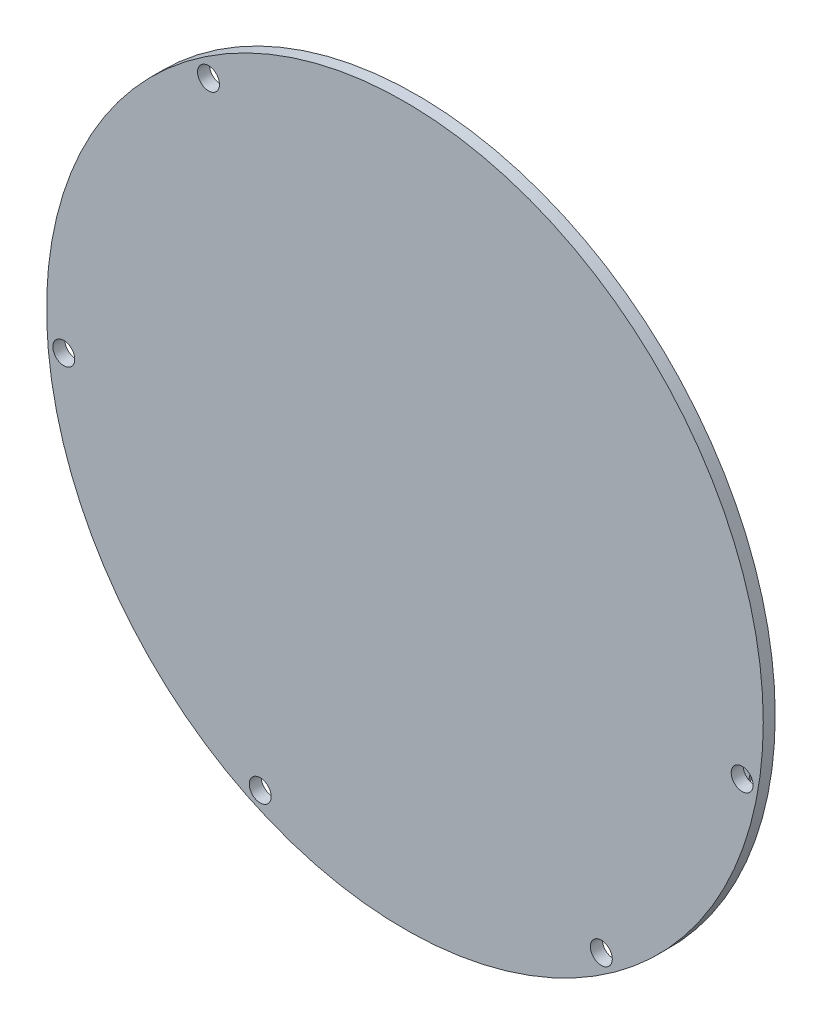
ISO-10303-21;
HEADER;
FILE_DESCRIPTION(('STEP AP214'),'2;1');
FILE_NAME('part.step','',(''),(''),'','','');
FILE_SCHEMA(('AUTOMOTIVE_DESIGN { 1 0 10303 214 1 1 1 1 }'));
ENDSEC;
DATA;
#1=APPLICATION_CONTEXT('core data for automotive mechanical design processes');
#2=APPLICATION_PROTOCOL_DEFINITION('international standard','automotive_design',2000,#1);
#3=PRODUCT_CONTEXT('',#1,'mechanical');
#4=PRODUCT('Part','Part','',(#3));
#5=PRODUCT_RELATED_PRODUCT_CATEGORY('part','',(#4));
#6=PRODUCT_DEFINITION_FORMATION('','',#4);
#7=PRODUCT_DEFINITION_CONTEXT('part definition',#1,'design');
#8=PRODUCT_DEFINITION('design','',#6,#7);
#9=PRODUCT_DEFINITION_SHAPE('','',#8);
#10=(LENGTH_UNIT() NAMED_UNIT(*) SI_UNIT(.MILLI.,.METRE.));
#11=(NAMED_UNIT(*) PLANE_ANGLE_UNIT() SI_UNIT($,.RADIAN.));
#12=(NAMED_UNIT(*) SI_UNIT($,.STERADIAN.) SOLID_ANGLE_UNIT());
#13=UNCERTAINTY_MEASURE_WITH_UNIT(LENGTH_MEASURE(1.E-05),#10,'distance_accuracy_value','');
#14=(GEOMETRIC_REPRESENTATION_CONTEXT(3) GLOBAL_UNCERTAINTY_ASSIGNED_CONTEXT((#13)) GLOBAL_UNIT_ASSIGNED_CONTEXT((#10,
#11,#12)) REPRESENTATION_CONTEXT('',''));
#15=CARTESIAN_POINT('',(0.,0.,0.));
#16=DIRECTION('',(0.,0.,1.));
#17=DIRECTION('',(1.,0.,0.));
#18=AXIS2_PLACEMENT_3D('',#15,#16,#17);
#19=CARTESIAN_POINT('',(15.58845726812,9.,62.6));
#20=DIRECTION('',(0.,0.,1.));
#21=DIRECTION('',(1.,0.,0.));
#22=AXIS2_PLACEMENT_3D('',#19,#20,#21);
#23=PLANE('',#22);
#24=CARTESIAN_POINT('',(15.58845726812,9.,62.6));
#25=DIRECTION('',(0.,0.,1.));
#26=DIRECTION('',(1.,0.,0.));
#27=AXIS2_PLACEMENT_3D('',#24,#25,#26);
#28=CIRCLE('',#27,2.);
#29=CARTESIAN_POINT('',(17.58845726812,9.,62.6));
#30=VERTEX_POINT('',#29);
#31=EDGE_CURVE('E9',#30,#30,#28,.T.);
#32=ORIENTED_EDGE('',*,*,#31,.F.);
#33=EDGE_LOOP('',(#32));
#34=FACE_BOUND('',#33,.T.);
#35=ADVANCED_FACE('F15',(#34),#23,.F.);
#36=CARTESIAN_POINT('',(-15.58845726812,9.,62.6));
#37=DIRECTION('',(0.,0.,1.));
#38=DIRECTION('',(1.,0.,0.));
#39=AXIS2_PLACEMENT_3D('',#36,#37,#38);
#40=PLANE('',#39);
#41=CARTESIAN_POINT('',(-15.58845726812,9.,62.6));
#42=DIRECTION('',(0.,0.,1.));
#43=DIRECTION('',(1.,0.,0.));
#44=AXIS2_PLACEMENT_3D('',#41,#42,#43);
#45=CIRCLE('',#44,2.);
#46=CARTESIAN_POINT('',(-13.58845726812,9.,62.6));
#47=VERTEX_POINT('',#46);
#48=EDGE_CURVE('E18',#47,#47,#45,.T.);
#49=ORIENTED_EDGE('',*,*,#48,.F.);
#50=EDGE_LOOP('',(#49));
#51=FACE_BOUND('',#50,.T.);
#52=ADVANCED_FACE('F376',(#51),#40,.F.);
#53=CARTESIAN_POINT('',(0.,-18.,62.6));
#54=DIRECTION('',(0.,0.,1.));
#55=DIRECTION('',(1.,0.,0.));
#56=AXIS2_PLACEMENT_3D('',#53,#54,#55);
#57=PLANE('',#56);
#58=CARTESIAN_POINT('',(0.,-18.,62.6));
#59=DIRECTION('',(0.,0.,1.));
#60=DIRECTION('',(1.,0.,0.));
#61=AXIS2_PLACEMENT_3D('',#58,#59,#60);
#62=CIRCLE('',#61,2.);
#63=CARTESIAN_POINT('',(2.,-18.,62.6));
#64=VERTEX_POINT('',#63);
#65=EDGE_CURVE('E222',#64,#64,#62,.T.);
#66=ORIENTED_EDGE('',*,*,#65,.F.);
#67=EDGE_LOOP('',(#66));
#68=FACE_BOUND('',#67,.T.);
#69=ADVANCED_FACE('F381',(#68),#57,.F.);
#70=CARTESIAN_POINT('',(15.58845726812,9.,62.6));
#71=DIRECTION('',(0.,0.,1.));
#72=DIRECTION('',(1.,0.,0.));
#73=AXIS2_PLACEMENT_3D('',#70,#71,#72);
#74=CYLINDRICAL_SURFACE('',#73,2.);
#75=CARTESIAN_POINT('',(15.58845726812,9.,75.5));
#76=DIRECTION('',(0.,0.,1.));
#77=DIRECTION('',(1.,0.,0.));
#78=AXIS2_PLACEMENT_3D('',#75,#76,#77);
#79=CIRCLE('',#78,2.);
#80=CARTESIAN_POINT('',(17.58845726812,9.,75.5));
#81=VERTEX_POINT('',#80);
#82=EDGE_CURVE('E225',#81,#81,#79,.T.);
#83=ORIENTED_EDGE('',*,*,#82,.F.);
#84=DIRECTION('',(0.,0.,1.));
#85=VECTOR('',#84,1.);
#86=CARTESIAN_POINT('',(17.58845726812,9.,62.6));
#87=LINE('',#86,#85);
#88=EDGE_CURVE('E24',#30,#81,#87,.T.);
#89=ORIENTED_EDGE('',*,*,#88,.F.);
#90=ORIENTED_EDGE('',*,*,#31,.T.);
#91=ORIENTED_EDGE('',*,*,#88,.T.);
#92=EDGE_LOOP('',(#83,#89,#90,#91));
#93=FACE_BOUND('',#92,.T.);
#94=ADVANCED_FACE('F382',(#93),#74,.T.);
#95=CARTESIAN_POINT('',(-15.58845726812,9.,62.6));
#96=DIRECTION('',(0.,0.,1.));
#97=DIRECTION('',(1.,0.,0.));
#98=AXIS2_PLACEMENT_3D('',#95,#96,#97);
#99=CYLINDRICAL_SURFACE('',#98,2.);
#100=CARTESIAN_POINT('',(-15.58845726812,9.,75.5));
#101=DIRECTION('',(0.,0.,1.));
#102=DIRECTION('',(1.,0.,0.));
#103=AXIS2_PLACEMENT_3D('',#100,#101,#102);
#104=CIRCLE('',#103,2.);
#105=CARTESIAN_POINT('',(-13.58845726812,9.,75.5));
#106=VERTEX_POINT('',#105);
#107=EDGE_CURVE('E256',#106,#106,#104,.T.);
#108=ORIENTED_EDGE('',*,*,#107,.F.);
#109=DIRECTION('',(0.,0.,1.));
#110=VECTOR('',#109,1.);
#111=CARTESIAN_POINT('',(-13.58845726812,9.,62.6));
#112=LINE('',#111,#110);
#113=EDGE_CURVE('E303',#47,#106,#112,.T.);
#114=ORIENTED_EDGE('',*,*,#113,.F.);
#115=ORIENTED_EDGE('',*,*,#48,.T.);
#116=ORIENTED_EDGE('',*,*,#113,.T.);
#117=EDGE_LOOP('',(#108,#114,#115,#116));
#118=FACE_BOUND('',#117,.T.);
#119=ADVANCED_FACE('F495',(#118),#99,.T.);
#120=CARTESIAN_POINT('',(0.,-18.,62.6));
#121=DIRECTION('',(0.,0.,1.));
#122=DIRECTION('',(1.,0.,0.));
#123=AXIS2_PLACEMENT_3D('',#120,#121,#122);
#124=CYLINDRICAL_SURFACE('',#123,2.);
#125=CARTESIAN_POINT('',(0.,-18.,75.5));
#126=DIRECTION('',(0.,0.,1.));
#127=DIRECTION('',(1.,0.,0.));
#128=AXIS2_PLACEMENT_3D('',#125,#126,#127);
#129=CIRCLE('',#128,2.);
#130=CARTESIAN_POINT('',(2.,-18.,75.5));
#131=VERTEX_POINT('',#130);
#132=EDGE_CURVE('E265',#131,#131,#129,.T.);
#133=ORIENTED_EDGE('',*,*,#132,.F.);
#134=DIRECTION('',(0.,0.,1.));
#135=VECTOR('',#134,1.);
#136=CARTESIAN_POINT('',(2.,-18.,62.6));
#137=LINE('',#136,#135);
#138=EDGE_CURVE('E217',#64,#131,#137,.T.);
#139=ORIENTED_EDGE('',*,*,#138,.F.);
#140=ORIENTED_EDGE('',*,*,#65,.T.);
#141=ORIENTED_EDGE('',*,*,#138,.T.);
#142=EDGE_LOOP('',(#133,#139,#140,#141));
#143=FACE_BOUND('',#142,.T.);
#144=ADVANCED_FACE('F386',(#143),#124,.T.);
#145=CARTESIAN_POINT('',(0.,0.,75.5));
#146=DIRECTION('',(0.,0.,1.));
#147=DIRECTION('',(1.,0.,0.));
#148=AXIS2_PLACEMENT_3D('',#145,#146,#147);
#149=PLANE('',#148);
#150=ORIENTED_EDGE('',*,*,#82,.T.);
#151=EDGE_LOOP('',(#150));
#152=FACE_BOUND('',#151,.T.);
#153=ORIENTED_EDGE('',*,*,#107,.T.);
#154=EDGE_LOOP('',(#153));
#155=FACE_BOUND('',#154,.T.);
#156=ORIENTED_EDGE('',*,*,#132,.T.);
#157=EDGE_LOOP('',(#156));
#158=FACE_BOUND('',#157,.T.);
#159=CARTESIAN_POINT('',(0.,0.,75.5));
#160=DIRECTION('',(0.,0.,1.));
#161=DIRECTION('',(1.,0.,0.));
#162=AXIS2_PLACEMENT_3D('',#159,#160,#161);
#163=CIRCLE('',#162,26.);
#164=CARTESIAN_POINT('',(26.,0.,75.5));
#165=VERTEX_POINT('',#164);
#166=EDGE_CURVE('E297',#165,#165,#163,.T.);
#167=ORIENTED_EDGE('',*,*,#166,.F.);
#168=EDGE_LOOP('',(#167));
#169=FACE_BOUND('',#168,.T.);
#170=ADVANCED_FACE('F384',(#152,#155,#158,#169),#149,.F.);
#171=CARTESIAN_POINT('',(0.,0.,38.5));
#172=DIRECTION('',(0.,0.,1.));
#173=DIRECTION('',(1.,0.,0.));
#174=AXIS2_PLACEMENT_3D('',#171,#172,#173);
#175=CYLINDRICAL_SURFACE('',#174,26.);
#176=CARTESIAN_POINT('',(0.,0.,56.));
#177=DIRECTION('',(0.,0.,1.));
#178=DIRECTION('',(1.,0.,0.));
#179=AXIS2_PLACEMENT_3D('',#176,#177,#178);
#180=CIRCLE('',#179,26.);
#181=CARTESIAN_POINT('',(26.,0.,56.));
#182=VERTEX_POINT('',#181);
#183=EDGE_CURVE('E289',#182,#182,#180,.T.);
#184=ORIENTED_EDGE('',*,*,#183,.F.);
#185=DIRECTION('',(0.,0.,1.));
#186=VECTOR('',#185,1.);
#187=CARTESIAN_POINT('',(26.,0.,38.5));
#188=LINE('',#187,#186);
#189=EDGE_CURVE('E292',#182,#165,#188,.T.);
#190=ORIENTED_EDGE('',*,*,#189,.T.);
#191=ORIENTED_EDGE('',*,*,#166,.T.);
#192=ORIENTED_EDGE('',*,*,#189,.F.);
#193=EDGE_LOOP('',(#184,#190,#191,#192));
#194=FACE_BOUND('',#193,.T.);
#195=ADVANCED_FACE('F389',(#194),#175,.F.);
#196=CARTESIAN_POINT('',(0.,0.,56.));
#197=DIRECTION('',(0.,0.,1.));
#198=DIRECTION('',(1.,0.,0.));
#199=AXIS2_PLACEMENT_3D('',#196,#197,#198);
#200=PLANE('',#199);
#201=CARTESIAN_POINT('',(0.,0.,56.));
#202=DIRECTION('',(0.,0.,1.));
#203=DIRECTION('',(1.,0.,0.));
#204=AXIS2_PLACEMENT_3D('',#201,#202,#203);
#205=CIRCLE('',#204,22.);
#206=CARTESIAN_POINT('',(22.,0.,56.));
#207=VERTEX_POINT('',#206);
#208=EDGE_CURVE('E290',#207,#207,#205,.T.);
#209=ORIENTED_EDGE('',*,*,#208,.F.);
#210=EDGE_LOOP('',(#209));
#211=FACE_BOUND('',#210,.T.);
#212=ORIENTED_EDGE('',*,*,#183,.T.);
#213=EDGE_LOOP('',(#212));
#214=FACE_BOUND('',#213,.T.);
#215=ADVANCED_FACE('F397',(#211,#214),#200,.T.);
#216=CARTESIAN_POINT('',(0.,0.,54.));
#217=DIRECTION('',(0.,0.,1.));
#218=DIRECTION('',(1.,0.,0.));
#219=AXIS2_PLACEMENT_3D('',#216,#217,#218);
#220=CYLINDRICAL_SURFACE('',#219,22.);
#221=DIRECTION('',(0.,0.,1.));
#222=VECTOR('',#221,1.);
#223=CARTESIAN_POINT('',(22.,0.,54.));
#224=LINE('',#223,#222);
#225=CARTESIAN_POINT('',(22.,0.,54.));
#226=VERTEX_POINT('',#225);
#227=EDGE_CURVE('E284',#226,#207,#224,.T.);
#228=ORIENTED_EDGE('',*,*,#227,.F.);
#229=CARTESIAN_POINT('',(0.,0.,54.));
#230=DIRECTION('',(0.,0.,1.));
#231=DIRECTION('',(1.,0.,0.));
#232=AXIS2_PLACEMENT_3D('',#229,#230,#231);
#233=CIRCLE('',#232,22.);
#234=EDGE_CURVE('E276',#226,#226,#233,.T.);
#235=ORIENTED_EDGE('',*,*,#234,.F.);
#236=ORIENTED_EDGE('',*,*,#227,.T.);
#237=ORIENTED_EDGE('',*,*,#208,.T.);
#238=EDGE_LOOP('',(#228,#235,#236,#237));
#239=FACE_BOUND('',#238,.T.);
#240=ADVANCED_FACE('F405',(#239),#220,.F.);
#241=CARTESIAN_POINT('',(0.,0.,54.));
#242=DIRECTION('',(0.,0.,1.));
#243=DIRECTION('',(1.,0.,0.));
#244=AXIS2_PLACEMENT_3D('',#241,#242,#243);
#245=PLANE('',#244);
#246=ORIENTED_EDGE('',*,*,#234,.T.);
#247=EDGE_LOOP('',(#246));
#248=FACE_BOUND('',#247,.T.);
#249=CARTESIAN_POINT('',(0.,0.,54.));
#250=DIRECTION('',(0.,0.,1.));
#251=DIRECTION('',(1.,0.,0.));
#252=AXIS2_PLACEMENT_3D('',#249,#250,#251);
#253=CIRCLE('',#252,26.);
#254=CARTESIAN_POINT('',(26.,0.,54.));
#255=VERTEX_POINT('',#254);
#256=EDGE_CURVE('E277',#255,#255,#253,.T.);
#257=ORIENTED_EDGE('',*,*,#256,.F.);
#258=EDGE_LOOP('',(#257));
#259=FACE_BOUND('',#258,.T.);
#260=ADVANCED_FACE('F407',(#248,#259),#245,.F.);
#261=CARTESIAN_POINT('',(0.,0.,38.5));
#262=DIRECTION('',(0.,0.,1.));
#263=DIRECTION('',(1.,0.,0.));
#264=AXIS2_PLACEMENT_3D('',#261,#262,#263);
#265=CYLINDRICAL_SURFACE('',#264,26.);
#266=DIRECTION('',(0.,0.,1.));
#267=VECTOR('',#266,1.);
#268=CARTESIAN_POINT('',(26.,0.,38.5));
#269=LINE('',#268,#267);
#270=CARTESIAN_POINT('',(26.,0.,38.5));
#271=VERTEX_POINT('',#270);
#272=EDGE_CURVE('E275',#271,#255,#269,.T.);
#273=ORIENTED_EDGE('',*,*,#272,.F.);
#274=CARTESIAN_POINT('',(0.,0.,38.5));
#275=DIRECTION('',(0.,0.,1.));
#276=DIRECTION('',(1.,0.,0.));
#277=AXIS2_PLACEMENT_3D('',#274,#275,#276);
#278=CIRCLE('',#277,26.);
#279=EDGE_CURVE('E268',#271,#271,#278,.T.);
#280=ORIENTED_EDGE('',*,*,#279,.F.);
#281=ORIENTED_EDGE('',*,*,#272,.T.);
#282=ORIENTED_EDGE('',*,*,#256,.T.);
#283=EDGE_LOOP('',(#273,#280,#281,#282));
#284=FACE_BOUND('',#283,.T.);
#285=ADVANCED_FACE('F485',(#284),#265,.F.);
#286=CARTESIAN_POINT('',(0.,0.,38.5));
#287=DIRECTION('',(0.,0.,1.));
#288=DIRECTION('',(1.,0.,0.));
#289=AXIS2_PLACEMENT_3D('',#286,#287,#288);
#290=PLANE('',#289);
#291=ORIENTED_EDGE('',*,*,#279,.T.);
#292=EDGE_LOOP('',(#291));
#293=FACE_BOUND('',#292,.T.);
#294=CARTESIAN_POINT('',(0.,0.,38.5));
#295=DIRECTION('',(0.,0.,1.));
#296=DIRECTION('',(1.,0.,0.));
#297=AXIS2_PLACEMENT_3D('',#294,#295,#296);
#298=CIRCLE('',#297,31.);
#299=CARTESIAN_POINT('',(31.,0.,38.5));
#300=VERTEX_POINT('',#299);
#301=EDGE_CURVE('E264',#300,#300,#298,.T.);
#302=ORIENTED_EDGE('',*,*,#301,.F.);
#303=EDGE_LOOP('',(#302));
#304=FACE_BOUND('',#303,.T.);
#305=ADVANCED_FACE('F476',(#293,#304),#290,.F.);
#306=CARTESIAN_POINT('',(0.,0.,38.5));
#307=DIRECTION('',(0.,0.,1.));
#308=DIRECTION('',(1.,0.,0.));
#309=AXIS2_PLACEMENT_3D('',#306,#307,#308);
#310=CYLINDRICAL_SURFACE('',#309,31.);
#311=CARTESIAN_POINT('',(0.,0.,75.5));
#312=DIRECTION('',(0.,0.,1.));
#313=DIRECTION('',(1.,0.,0.));
#314=AXIS2_PLACEMENT_3D('',#311,#312,#313);
#315=CIRCLE('',#314,31.);
#316=CARTESIAN_POINT('',(31.,0.,75.5));
#317=VERTEX_POINT('',#316);
#318=EDGE_CURVE('E251',#317,#317,#315,.T.);
#319=ORIENTED_EDGE('',*,*,#318,.F.);
#320=DIRECTION('',(0.,0.,1.));
#321=VECTOR('',#320,1.);
#322=CARTESIAN_POINT('',(31.,0.,38.5));
#323=LINE('',#322,#321);
#324=EDGE_CURVE('E260',#300,#317,#323,.T.);
#325=ORIENTED_EDGE('',*,*,#324,.F.);
#326=ORIENTED_EDGE('',*,*,#301,.T.);
#327=ORIENTED_EDGE('',*,*,#324,.T.);
#328=EDGE_LOOP('',(#319,#325,#326,#327));
#329=FACE_BOUND('',#328,.T.);
#330=ADVANCED_FACE('F475',(#329),#310,.T.);
#331=CARTESIAN_POINT('',(0.,0.,75.5));
#332=DIRECTION('',(0.,0.,1.));
#333=DIRECTION('',(1.,0.,0.));
#334=AXIS2_PLACEMENT_3D('',#331,#332,#333);
#335=PLANE('',#334);
#336=ORIENTED_EDGE('',*,*,#318,.T.);
#337=EDGE_LOOP('',(#336));
#338=FACE_BOUND('',#337,.T.);
#339=CARTESIAN_POINT('',(0.,0.,75.5));
#340=DIRECTION('',(0.,0.,1.));
#341=DIRECTION('',(1.,0.,0.));
#342=AXIS2_PLACEMENT_3D('',#339,#340,#341);
#343=CIRCLE('',#342,76.5);
#344=CARTESIAN_POINT('',(76.5,0.,75.5));
#345=VERTEX_POINT('',#344);
#346=EDGE_CURVE('E248',#345,#345,#343,.T.);
#347=ORIENTED_EDGE('',*,*,#346,.F.);
#348=EDGE_LOOP('',(#347));
#349=FACE_BOUND('',#348,.T.);
#350=ADVANCED_FACE('F468',(#338,#349),#335,.F.);
#351=CARTESIAN_POINT('',(0.,0.,70.5));
#352=DIRECTION('',(0.,0.,1.));
#353=DIRECTION('',(1.,0.,0.));
#354=AXIS2_PLACEMENT_3D('',#351,#352,#353);
#355=CYLINDRICAL_SURFACE('',#354,76.5);
#356=DIRECTION('',(0.,0.,1.));
#357=VECTOR('',#356,1.);
#358=CARTESIAN_POINT('',(76.5,0.,70.5));
#359=LINE('',#358,#357);
#360=CARTESIAN_POINT('',(76.5,0.,70.5));
#361=VERTEX_POINT('',#360);
#362=EDGE_CURVE('E247',#361,#345,#359,.T.);
#363=ORIENTED_EDGE('',*,*,#362,.F.);
#364=CARTESIAN_POINT('',(0.,0.,70.5));
#365=DIRECTION('',(0.,0.,1.));
#366=DIRECTION('',(1.,0.,0.));
#367=AXIS2_PLACEMENT_3D('',#364,#365,#366);
#368=CIRCLE('',#367,76.5);
#369=EDGE_CURVE('E245',#361,#361,#368,.T.);
#370=ORIENTED_EDGE('',*,*,#369,.F.);
#371=ORIENTED_EDGE('',*,*,#362,.T.);
#372=ORIENTED_EDGE('',*,*,#346,.T.);
#373=EDGE_LOOP('',(#363,#370,#371,#372));
#374=FACE_BOUND('',#373,.T.);
#375=ADVANCED_FACE('F467',(#374),#355,.F.);
#376=CARTESIAN_POINT('',(0.,0.,70.5));
#377=DIRECTION('',(0.,0.,1.));
#378=DIRECTION('',(1.,0.,0.));
#379=AXIS2_PLACEMENT_3D('',#376,#377,#378);
#380=PLANE('',#379);
#381=ORIENTED_EDGE('',*,*,#369,.T.);
#382=EDGE_LOOP('',(#381));
#383=FACE_BOUND('',#382,.T.);
#384=CARTESIAN_POINT('',(0.,0.,70.5));
#385=DIRECTION('',(0.,0.,1.));
#386=DIRECTION('',(1.,0.,0.));
#387=AXIS2_PLACEMENT_3D('',#384,#385,#386);
#388=CIRCLE('',#387,81.98);
#389=CARTESIAN_POINT('',(81.98,0.,70.5));
#390=VERTEX_POINT('',#389);
#391=EDGE_CURVE('E237',#390,#390,#388,.T.);
#392=ORIENTED_EDGE('',*,*,#391,.F.);
#393=EDGE_LOOP('',(#392));
#394=FACE_BOUND('',#393,.T.);
#395=ADVANCED_FACE('F462',(#383,#394),#380,.F.);
#396=CARTESIAN_POINT('',(0.,0.,70.5));
#397=DIRECTION('',(0.,0.,1.));
#398=DIRECTION('',(1.,0.,0.));
#399=AXIS2_PLACEMENT_3D('',#396,#397,#398);
#400=CYLINDRICAL_SURFACE('',#399,81.98);
#401=CARTESIAN_POINT('',(0.,0.,71.2));
#402=DIRECTION('',(0.,0.,1.));
#403=DIRECTION('',(1.,0.,0.));
#404=AXIS2_PLACEMENT_3D('',#401,#402,#403);
#405=CIRCLE('',#404,81.98);
#406=CARTESIAN_POINT('',(81.98,0.,71.2));
#407=VERTEX_POINT('',#406);
#408=EDGE_CURVE('E235',#407,#407,#405,.T.);
#409=ORIENTED_EDGE('',*,*,#408,.F.);
#410=DIRECTION('',(0.,0.,1.));
#411=VECTOR('',#410,1.);
#412=CARTESIAN_POINT('',(81.98,0.,70.5));
#413=LINE('',#412,#411);
#414=EDGE_CURVE('E240',#390,#407,#413,.T.);
#415=ORIENTED_EDGE('',*,*,#414,.F.);
#416=ORIENTED_EDGE('',*,*,#391,.T.);
#417=ORIENTED_EDGE('',*,*,#414,.T.);
#418=EDGE_LOOP('',(#409,#415,#416,#417));
#419=FACE_BOUND('',#418,.T.);
#420=ADVANCED_FACE('F461',(#419),#400,.T.);
#421=CARTESIAN_POINT('',(0.,0.,71.2));
#422=DIRECTION('',(0.,0.,1.));
#423=DIRECTION('',(1.,0.,0.));
#424=AXIS2_PLACEMENT_3D('',#421,#422,#423);
#425=PLANE('',#424);
#426=CARTESIAN_POINT('',(0.,0.,71.2));
#427=DIRECTION('',(0.,0.,1.));
#428=DIRECTION('',(1.,0.,0.));
#429=AXIS2_PLACEMENT_3D('',#426,#427,#428);
#430=CIRCLE('',#429,80.1);
#431=CARTESIAN_POINT('',(80.1,0.,71.2));
#432=VERTEX_POINT('',#431);
#433=EDGE_CURVE('E228',#432,#432,#430,.T.);
#434=ORIENTED_EDGE('',*,*,#433,.F.);
#435=EDGE_LOOP('',(#434));
#436=FACE_BOUND('',#435,.T.);
#437=ORIENTED_EDGE('',*,*,#408,.T.);
#438=EDGE_LOOP('',(#437));
#439=FACE_BOUND('',#438,.T.);
#440=ADVANCED_FACE('F456',(#436,#439),#425,.T.);
#441=CARTESIAN_POINT('',(0.,0.,71.2));
#442=DIRECTION('',(0.,0.,1.));
#443=DIRECTION('',(1.,0.,0.));
#444=AXIS2_PLACEMENT_3D('',#441,#442,#443);
#445=CYLINDRICAL_SURFACE('',#444,80.1);
#446=CARTESIAN_POINT('',(0.,0.,74.4));
#447=DIRECTION('',(0.,0.,1.));
#448=DIRECTION('',(1.,0.,0.));
#449=AXIS2_PLACEMENT_3D('',#446,#447,#448);
#450=CIRCLE('',#449,80.1);
#451=CARTESIAN_POINT('',(80.1,0.,74.4));
#452=VERTEX_POINT('',#451);
#453=EDGE_CURVE('E220',#452,#452,#450,.T.);
#454=ORIENTED_EDGE('',*,*,#453,.F.);
#455=DIRECTION('',(0.,0.,1.));
#456=VECTOR('',#455,1.);
#457=CARTESIAN_POINT('',(80.1,0.,71.2));
#458=LINE('',#457,#456);
#459=EDGE_CURVE('E226',#432,#452,#458,.T.);
#460=ORIENTED_EDGE('',*,*,#459,.F.);
#461=ORIENTED_EDGE('',*,*,#433,.T.);
#462=ORIENTED_EDGE('',*,*,#459,.T.);
#463=EDGE_LOOP('',(#454,#460,#461,#462));
#464=FACE_BOUND('',#463,.T.);
#465=ADVANCED_FACE('F453',(#464),#445,.T.);
#466=CARTESIAN_POINT('',(0.,0.,74.4));
#467=DIRECTION('',(0.,0.,1.));
#468=DIRECTION('',(1.,0.,0.));
#469=AXIS2_PLACEMENT_3D('',#466,#467,#468);
#470=PLANE('',#469);
#471=ORIENTED_EDGE('',*,*,#453,.T.);
#472=EDGE_LOOP('',(#471));
#473=FACE_BOUND('',#472,.T.);
#474=CARTESIAN_POINT('',(0.,0.,74.4));
#475=DIRECTION('',(0.,0.,1.));
#476=DIRECTION('',(1.,0.,0.));
#477=AXIS2_PLACEMENT_3D('',#474,#475,#476);
#478=CIRCLE('',#477,81.98);
#479=CARTESIAN_POINT('',(81.98,0.,74.4));
#480=VERTEX_POINT('',#479);
#481=EDGE_CURVE('E207',#480,#480,#478,.T.);
#482=ORIENTED_EDGE('',*,*,#481,.F.);
#483=EDGE_LOOP('',(#482));
#484=FACE_BOUND('',#483,.T.);
#485=ADVANCED_FACE('F447',(#473,#484),#470,.F.);
#486=CARTESIAN_POINT('',(0.,0.,70.5));
#487=DIRECTION('',(0.,0.,1.));
#488=DIRECTION('',(1.,0.,0.));
#489=AXIS2_PLACEMENT_3D('',#486,#487,#488);
#490=CYLINDRICAL_SURFACE('',#489,81.98);
#491=DIRECTION('',(0.,0.,1.));
#492=VECTOR('',#491,1.);
#493=CARTESIAN_POINT('',(81.98,0.,70.5));
#494=LINE('',#493,#492);
#495=CARTESIAN_POINT('',(81.98,0.,75.5));
#496=VERTEX_POINT('',#495);
#497=EDGE_CURVE('E206',#480,#496,#494,.T.);
#498=ORIENTED_EDGE('',*,*,#497,.T.);
#499=CARTESIAN_POINT('',(0.,0.,75.5));
#500=DIRECTION('',(0.,0.,1.));
#501=DIRECTION('',(1.,0.,0.));
#502=AXIS2_PLACEMENT_3D('',#499,#500,#501);
#503=CIRCLE('',#502,81.98);
#504=EDGE_CURVE('E204',#496,#496,#503,.T.);
#505=ORIENTED_EDGE('',*,*,#504,.F.);
#506=ORIENTED_EDGE('',*,*,#497,.F.);
#507=ORIENTED_EDGE('',*,*,#481,.T.);
#508=EDGE_LOOP('',(#498,#505,#506,#507));
#509=FACE_BOUND('',#508,.T.);
#510=ADVANCED_FACE('F438',(#509),#490,.T.);
#511=CARTESIAN_POINT('',(-49.32757352619,70.447075808853,74.5));
#512=DIRECTION('',(0.,0.,1.));
#513=DIRECTION('',(1.,0.,0.));
#514=AXIS2_PLACEMENT_3D('',#511,#512,#513);
#515=CYLINDRICAL_SURFACE('',#514,2.75);
#516=DIRECTION('',(0.,0.,1.));
#517=VECTOR('',#516,1.);
#518=CARTESIAN_POINT('',(-46.57757352619,70.447075808853,74.5));
#519=LINE('',#518,#517);
#520=CARTESIAN_POINT('',(-46.57757352619,70.447075808853,75.5));
#521=VERTEX_POINT('',#520);
#522=CARTESIAN_POINT('',(-46.57757352619,70.447075808853,78.5));
#523=VERTEX_POINT('',#522);
#524=EDGE_CURVE('E209',#521,#523,#519,.T.);
#525=ORIENTED_EDGE('',*,*,#524,.F.);
#526=CARTESIAN_POINT('',(-49.32757352619,70.447075808853,75.5));
#527=DIRECTION('',(0.,0.,1.));
#528=DIRECTION('',(1.,0.,0.));
#529=AXIS2_PLACEMENT_3D('',#526,#527,#528);
#530=CIRCLE('',#529,2.75);
#531=EDGE_CURVE('E193',#521,#521,#530,.T.);
#532=ORIENTED_EDGE('',*,*,#531,.F.);
#533=ORIENTED_EDGE('',*,*,#524,.T.);
#534=CARTESIAN_POINT('',(-49.32757352619,70.447075808853,78.5));
#535=DIRECTION('',(0.,0.,1.));
#536=DIRECTION('',(1.,0.,0.));
#537=AXIS2_PLACEMENT_3D('',#534,#535,#536);
#538=CIRCLE('',#537,2.75);
#539=EDGE_CURVE('E322',#523,#523,#538,.T.);
#540=ORIENTED_EDGE('',*,*,#539,.T.);
#541=EDGE_LOOP('',(#525,#532,#533,#540));
#542=FACE_BOUND('',#541,.T.);
#543=ADVANCED_FACE('F436',(#542),#515,.F.);
#544=CARTESIAN_POINT('',(84.69346675905,-14.93374327935,74.5));
#545=DIRECTION('',(0.,0.,1.));
#546=DIRECTION('',(1.,0.,0.));
#547=AXIS2_PLACEMENT_3D('',#544,#545,#546);
#548=CYLINDRICAL_SURFACE('',#547,2.75);
#549=DIRECTION('',(0.,0.,1.));
#550=VECTOR('',#549,1.);
#551=CARTESIAN_POINT('',(87.44346675905,-14.93374327935,74.5));
#552=LINE('',#551,#550);
#553=CARTESIAN_POINT('',(87.44346675905,-14.93374327935,75.5));
#554=VERTEX_POINT('',#553);
#555=CARTESIAN_POINT('',(87.44346675905,-14.93374327935,78.5));
#556=VERTEX_POINT('',#555);
#557=EDGE_CURVE('E179',#554,#556,#552,.T.);
#558=ORIENTED_EDGE('',*,*,#557,.F.);
#559=CARTESIAN_POINT('',(84.69346675905,-14.93374327935,75.5));
#560=DIRECTION('',(0.,0.,1.));
#561=DIRECTION('',(1.,0.,0.));
#562=AXIS2_PLACEMENT_3D('',#559,#560,#561);
#563=CIRCLE('',#562,2.75);
#564=EDGE_CURVE('E190',#554,#554,#563,.T.);
#565=ORIENTED_EDGE('',*,*,#564,.F.);
#566=ORIENTED_EDGE('',*,*,#557,.T.);
#567=CARTESIAN_POINT('',(84.69346675905,-14.93374327935,78.5));
#568=DIRECTION('',(0.,0.,1.));
#569=DIRECTION('',(1.,0.,0.));
#570=AXIS2_PLACEMENT_3D('',#567,#568,#569);
#571=CIRCLE('',#570,2.75);
#572=EDGE_CURVE('E321',#556,#556,#571,.T.);
#573=ORIENTED_EDGE('',*,*,#572,.T.);
#574=EDGE_LOOP('',(#558,#565,#566,#573));
#575=FACE_BOUND('',#574,.T.);
#576=ADVANCED_FACE('F437',(#575),#548,.F.);
#577=CARTESIAN_POINT('',(49.32757352619,-70.44707580885,74.5));
#578=DIRECTION('',(0.,0.,1.));
#579=DIRECTION('',(1.,0.,0.));
#580=AXIS2_PLACEMENT_3D('',#577,#578,#579);
#581=CYLINDRICAL_SURFACE('',#580,2.75);
#582=DIRECTION('',(0.,0.,1.));
#583=VECTOR('',#582,1.);
#584=CARTESIAN_POINT('',(52.07757352619,-70.44707580885,74.5));
#585=LINE('',#584,#583);
#586=CARTESIAN_POINT('',(52.07757352619,-70.44707580885,75.5));
#587=VERTEX_POINT('',#586);
#588=CARTESIAN_POINT('',(52.07757352619,-70.44707580885,78.5));
#589=VERTEX_POINT('',#588);
#590=EDGE_CURVE('E174',#587,#589,#585,.T.);
#591=ORIENTED_EDGE('',*,*,#590,.F.);
#592=CARTESIAN_POINT('',(49.32757352619,-70.44707580885,75.5));
#593=DIRECTION('',(0.,0.,1.));
#594=DIRECTION('',(1.,0.,0.));
#595=AXIS2_PLACEMENT_3D('',#592,#593,#594);
#596=CIRCLE('',#595,2.75);
#597=EDGE_CURVE('E176',#587,#587,#596,.T.);
#598=ORIENTED_EDGE('',*,*,#597,.F.);
#599=ORIENTED_EDGE('',*,*,#590,.T.);
#600=CARTESIAN_POINT('',(49.32757352619,-70.44707580885,78.5));
#601=DIRECTION('',(0.,0.,1.));
#602=DIRECTION('',(1.,0.,0.));
#603=AXIS2_PLACEMENT_3D('',#600,#601,#602);
#604=CIRCLE('',#603,2.75);
#605=EDGE_CURVE('E178',#589,#589,#604,.T.);
#606=ORIENTED_EDGE('',*,*,#605,.T.);
#607=EDGE_LOOP('',(#591,#598,#599,#606));
#608=FACE_BOUND('',#607,.T.);
#609=ADVANCED_FACE('F175',(#608),#581,.F.);
#610=CARTESIAN_POINT('',(-85.67274403589,-7.495393876299,74.5));
#611=DIRECTION('',(0.,0.,1.));
#612=DIRECTION('',(1.,0.,0.));
#613=AXIS2_PLACEMENT_3D('',#610,#611,#612);
#614=CYLINDRICAL_SURFACE('',#613,2.75);
#615=DIRECTION('',(0.,0.,1.));
#616=VECTOR('',#615,1.);
#617=CARTESIAN_POINT('',(-82.92274403589,-7.495393876299,74.5));
#618=LINE('',#617,#616);
#619=CARTESIAN_POINT('',(-82.92274403589,-7.495393876299,75.5));
#620=VERTEX_POINT('',#619);
#621=CARTESIAN_POINT('',(-82.92274403589,-7.495393876299,78.5));
#622=VERTEX_POINT('',#621);
#623=EDGE_CURVE('E185',#620,#622,#618,.T.);
#624=ORIENTED_EDGE('',*,*,#623,.F.);
#625=CARTESIAN_POINT('',(-85.67274403589,-7.495393876299,75.5));
#626=DIRECTION('',(0.,0.,1.));
#627=DIRECTION('',(1.,0.,0.));
#628=AXIS2_PLACEMENT_3D('',#625,#626,#627);
#629=CIRCLE('',#628,2.75);
#630=EDGE_CURVE('E187',#620,#620,#629,.T.);
#631=ORIENTED_EDGE('',*,*,#630,.F.);
#632=ORIENTED_EDGE('',*,*,#623,.T.);
#633=CARTESIAN_POINT('',(-85.67274403589,-7.495393876299,78.5));
#634=DIRECTION('',(0.,0.,1.));
#635=DIRECTION('',(1.,0.,0.));
#636=AXIS2_PLACEMENT_3D('',#633,#634,#635);
#637=CIRCLE('',#636,2.75);
#638=EDGE_CURVE('E345',#622,#622,#637,.T.);
#639=ORIENTED_EDGE('',*,*,#638,.T.);
#640=EDGE_LOOP('',(#624,#631,#632,#639));
#641=FACE_BOUND('',#640,.T.);
#642=ADVANCED_FACE('F356',(#641),#614,.F.);
#643=CARTESIAN_POINT('',(-36.3451705097,-77.94246968515,74.5));
#644=DIRECTION('',(0.,0.,1.));
#645=DIRECTION('',(1.,0.,0.));
#646=AXIS2_PLACEMENT_3D('',#643,#644,#645);
#647=CYLINDRICAL_SURFACE('',#646,2.75);
#648=DIRECTION('',(0.,0.,1.));
#649=VECTOR('',#648,1.);
#650=CARTESIAN_POINT('',(-33.5951705097,-77.94246968515,74.5));
#651=LINE('',#650,#649);
#652=CARTESIAN_POINT('',(-33.5951705097,-77.94246968515,75.5));
#653=VERTEX_POINT('',#652);
#654=CARTESIAN_POINT('',(-33.5951705097,-77.94246968515,78.5));
#655=VERTEX_POINT('',#654);
#656=EDGE_CURVE('E201',#653,#655,#651,.T.);
#657=ORIENTED_EDGE('',*,*,#656,.F.);
#658=CARTESIAN_POINT('',(-36.3451705097,-77.94246968515,75.5));
#659=DIRECTION('',(0.,0.,1.));
#660=DIRECTION('',(1.,0.,0.));
#661=AXIS2_PLACEMENT_3D('',#658,#659,#660);
#662=CIRCLE('',#661,2.75);
#663=EDGE_CURVE('E200',#653,#653,#662,.T.);
#664=ORIENTED_EDGE('',*,*,#663,.F.);
#665=ORIENTED_EDGE('',*,*,#656,.T.);
#666=CARTESIAN_POINT('',(-36.3451705097,-77.94246968515,78.5));
#667=DIRECTION('',(0.,0.,1.));
#668=DIRECTION('',(1.,0.,0.));
#669=AXIS2_PLACEMENT_3D('',#666,#667,#668);
#670=CIRCLE('',#669,2.75);
#671=EDGE_CURVE('E338',#655,#655,#670,.T.);
#672=ORIENTED_EDGE('',*,*,#671,.T.);
#673=EDGE_LOOP('',(#657,#664,#665,#672));
#674=FACE_BOUND('',#673,.T.);
#675=ADVANCED_FACE('F336',(#674),#647,.F.);
#676=CARTESIAN_POINT('',(0.,0.,75.5));
#677=DIRECTION('',(0.,0.,1.));
#678=DIRECTION('',(1.,0.,0.));
#679=AXIS2_PLACEMENT_3D('',#676,#677,#678);
#680=PLANE('',#679);
#681=ORIENTED_EDGE('',*,*,#504,.T.);
#682=EDGE_LOOP('',(#681));
#683=FACE_BOUND('',#682,.T.);
#684=ORIENTED_EDGE('',*,*,#531,.T.);
#685=EDGE_LOOP('',(#684));
#686=FACE_BOUND('',#685,.T.);
#687=ORIENTED_EDGE('',*,*,#564,.T.);
#688=EDGE_LOOP('',(#687));
#689=FACE_BOUND('',#688,.T.);
#690=ORIENTED_EDGE('',*,*,#597,.T.);
#691=EDGE_LOOP('',(#690));
#692=FACE_BOUND('',#691,.T.);
#693=ORIENTED_EDGE('',*,*,#630,.T.);
#694=EDGE_LOOP('',(#693));
#695=FACE_BOUND('',#694,.T.);
#696=ORIENTED_EDGE('',*,*,#663,.T.);
#697=EDGE_LOOP('',(#696));
#698=FACE_BOUND('',#697,.T.);
#699=CARTESIAN_POINT('',(0.,0.,75.5));
#700=DIRECTION('',(0.,0.,1.));
#701=DIRECTION('',(1.,0.,0.));
#702=AXIS2_PLACEMENT_3D('',#699,#700,#701);
#703=CIRCLE('',#702,90.);
#704=CARTESIAN_POINT('',(90.,0.,75.5));
#705=VERTEX_POINT('',#704);
#706=EDGE_CURVE('E343',#705,#705,#703,.T.);
#707=ORIENTED_EDGE('',*,*,#706,.F.);
#708=EDGE_LOOP('',(#707));
#709=FACE_BOUND('',#708,.T.);
#710=ADVANCED_FACE('F182',(#683,#686,#689,#692,#695,#698,#709),#680,.F.);
#711=CARTESIAN_POINT('',(0.,0.,78.5));
#712=DIRECTION('',(0.,0.,1.));
#713=DIRECTION('',(1.,0.,0.));
#714=AXIS2_PLACEMENT_3D('',#711,#712,#713);
#715=PLANE('',#714);
#716=ORIENTED_EDGE('',*,*,#539,.F.);
#717=EDGE_LOOP('',(#716));
#718=FACE_BOUND('',#717,.T.);
#719=ORIENTED_EDGE('',*,*,#572,.F.);
#720=EDGE_LOOP('',(#719));
#721=FACE_BOUND('',#720,.T.);
#722=ORIENTED_EDGE('',*,*,#605,.F.);
#723=EDGE_LOOP('',(#722));
#724=FACE_BOUND('',#723,.T.);
#725=ORIENTED_EDGE('',*,*,#638,.F.);
#726=EDGE_LOOP('',(#725));
#727=FACE_BOUND('',#726,.T.);
#728=ORIENTED_EDGE('',*,*,#671,.F.);
#729=EDGE_LOOP('',(#728));
#730=FACE_BOUND('',#729,.T.);
#731=CARTESIAN_POINT('',(0.,0.,78.5));
#732=DIRECTION('',(0.,0.,1.));
#733=DIRECTION('',(1.,0.,0.));
#734=AXIS2_PLACEMENT_3D('',#731,#732,#733);
#735=CIRCLE('',#734,90.);
#736=CARTESIAN_POINT('',(90.,0.,78.5));
#737=VERTEX_POINT('',#736);
#738=EDGE_CURVE('E423',#737,#737,#735,.T.);
#739=ORIENTED_EDGE('',*,*,#738,.T.);
#740=EDGE_LOOP('',(#739));
#741=FACE_BOUND('',#740,.T.);
#742=ADVANCED_FACE('F362',(#718,#721,#724,#727,#730,#741),#715,.T.);
#743=CARTESIAN_POINT('',(0.,0.,75.5));
#744=DIRECTION('',(0.,0.,1.));
#745=DIRECTION('',(1.,0.,0.));
#746=AXIS2_PLACEMENT_3D('',#743,#744,#745);
#747=CYLINDRICAL_SURFACE('',#746,90.);
#748=ORIENTED_EDGE('',*,*,#738,.F.);
#749=DIRECTION('',(0.,0.,1.));
#750=VECTOR('',#749,1.);
#751=CARTESIAN_POINT('',(90.,0.,75.5));
#752=LINE('',#751,#750);
#753=EDGE_CURVE('E351',#705,#737,#752,.T.);
#754=ORIENTED_EDGE('',*,*,#753,.F.);
#755=ORIENTED_EDGE('',*,*,#706,.T.);
#756=ORIENTED_EDGE('',*,*,#753,.T.);
#757=EDGE_LOOP('',(#748,#754,#755,#756));
#758=FACE_BOUND('',#757,.T.);
#759=ADVANCED_FACE('F367',(#758),#747,.T.);
#760=CLOSED_SHELL('',(#35,#52,#69,#94,#119,#144,#170,#195,#215,#240,#260,#285,#305,#330,#350,
#375,#395,#420,#440,#465,#485,#510,#543,#576,#609,#642,#675,#710,#742,#759));
#761=MANIFOLD_SOLID_BREP('B1',#760);
#762=ADVANCED_BREP_SHAPE_REPRESENTATION('',(#18,#761),#14);
#763=SHAPE_DEFINITION_REPRESENTATION(#9,#762);
ENDSEC;
END-ISO-10303-21;
